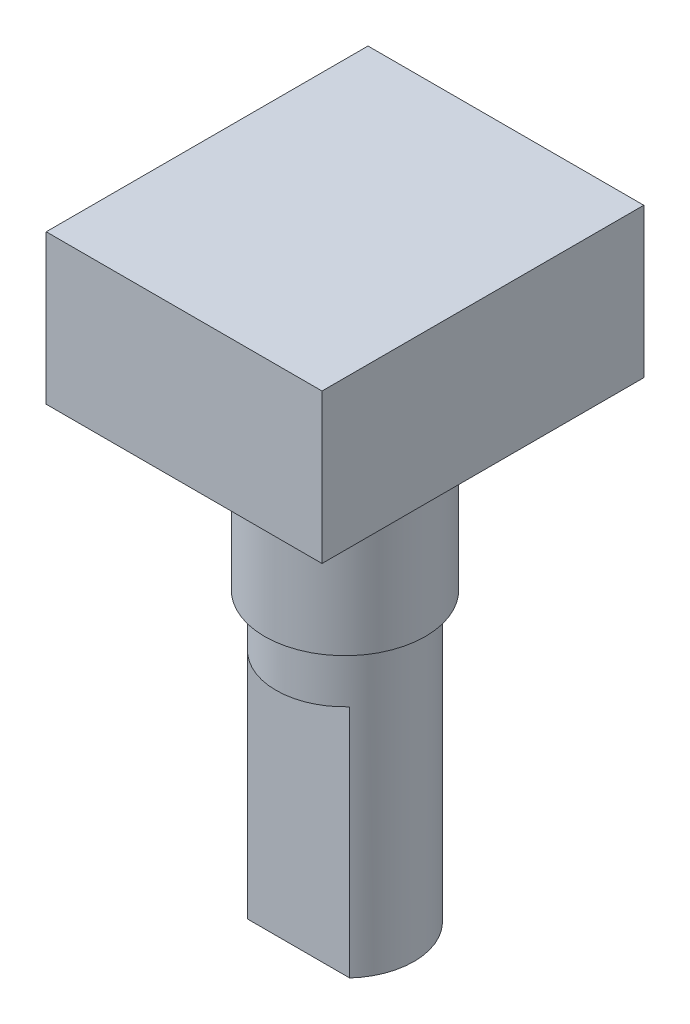
ISO-10303-21;
HEADER;
FILE_DESCRIPTION(('STEP AP214'),'2;1');
FILE_NAME('part.step','',(''),(''),'','','');
FILE_SCHEMA(('AUTOMOTIVE_DESIGN { 1 0 10303 214 1 1 1 1 }'));
ENDSEC;
DATA;
#1=APPLICATION_CONTEXT('core data for automotive mechanical design processes');
#2=APPLICATION_PROTOCOL_DEFINITION('international standard','automotive_design',2000,#1);
#3=PRODUCT_CONTEXT('',#1,'mechanical');
#4=PRODUCT('Part','Part','',(#3));
#5=PRODUCT_RELATED_PRODUCT_CATEGORY('part','',(#4));
#6=PRODUCT_DEFINITION_FORMATION('','',#4);
#7=PRODUCT_DEFINITION_CONTEXT('part definition',#1,'design');
#8=PRODUCT_DEFINITION('design','',#6,#7);
#9=PRODUCT_DEFINITION_SHAPE('','',#8);
#10=(LENGTH_UNIT() NAMED_UNIT(*) SI_UNIT(.MILLI.,.METRE.));
#11=(NAMED_UNIT(*) PLANE_ANGLE_UNIT() SI_UNIT($,.RADIAN.));
#12=(NAMED_UNIT(*) SI_UNIT($,.STERADIAN.) SOLID_ANGLE_UNIT());
#13=UNCERTAINTY_MEASURE_WITH_UNIT(LENGTH_MEASURE(1.E-05),#10,'distance_accuracy_value','');
#14=(GEOMETRIC_REPRESENTATION_CONTEXT(3) GLOBAL_UNCERTAINTY_ASSIGNED_CONTEXT((#13)) GLOBAL_UNIT_ASSIGNED_CONTEXT((#10,
#11,#12)) REPRESENTATION_CONTEXT('',''));
#15=CARTESIAN_POINT('',(0.,0.,0.));
#16=DIRECTION('',(0.,0.,1.));
#17=DIRECTION('',(1.,0.,0.));
#18=AXIS2_PLACEMENT_3D('',#15,#16,#17);
#19=CARTESIAN_POINT('',(-6.,6.50000000000001,7.00000000000001));
#20=DIRECTION('',(1.,0.,0.));
#21=DIRECTION('',(0.,0.,-1.));
#22=AXIS2_PLACEMENT_3D('',#19,#20,#21);
#23=PLANE('',#22);
#24=DIRECTION('',(0.,0.,1.));
#25=VECTOR('',#24,1.);
#26=CARTESIAN_POINT('',(-6.,0.,7.00000000000001));
#27=LINE('',#26,#25);
#28=CARTESIAN_POINT('',(-6.,0.,-7.));
#29=VERTEX_POINT('',#28);
#30=CARTESIAN_POINT('',(-6.,0.,7.00000000000001));
#31=VERTEX_POINT('',#30);
#32=EDGE_CURVE('E113',#29,#31,#27,.T.);
#33=ORIENTED_EDGE('',*,*,#32,.T.);
#34=DIRECTION('',(0.,-1.,0.));
#35=VECTOR('',#34,1.);
#36=CARTESIAN_POINT('',(-6.,6.50000000000001,7.00000000000001));
#37=LINE('',#36,#35);
#38=CARTESIAN_POINT('',(-6.,6.50000000000001,7.00000000000001));
#39=VERTEX_POINT('',#38);
#40=EDGE_CURVE('E139',#39,#31,#37,.T.);
#41=ORIENTED_EDGE('',*,*,#40,.F.);
#42=DIRECTION('',(0.,0.,1.));
#43=VECTOR('',#42,1.);
#44=CARTESIAN_POINT('',(-6.,6.50000000000001,7.00000000000001));
#45=LINE('',#44,#43);
#46=CARTESIAN_POINT('',(-6.,6.50000000000001,-7.));
#47=VERTEX_POINT('',#46);
#48=EDGE_CURVE('E119',#47,#39,#45,.T.);
#49=ORIENTED_EDGE('',*,*,#48,.F.);
#50=DIRECTION('',(0.,-1.,0.));
#51=VECTOR('',#50,1.);
#52=CARTESIAN_POINT('',(-6.,6.50000000000001,-7.));
#53=LINE('',#52,#51);
#54=EDGE_CURVE('E125',#47,#29,#53,.T.);
#55=ORIENTED_EDGE('',*,*,#54,.T.);
#56=EDGE_LOOP('',(#33,#41,#49,#55));
#57=FACE_BOUND('',#56,.T.);
#58=ADVANCED_FACE('F34',(#57),#23,.F.);
#59=CARTESIAN_POINT('',(6.,6.50000000000001,7.00000000000001));
#60=DIRECTION('',(0.,0.,-1.));
#61=DIRECTION('',(-1.,0.,0.));
#62=AXIS2_PLACEMENT_3D('',#59,#60,#61);
#63=PLANE('',#62);
#64=DIRECTION('',(1.,0.,0.));
#65=VECTOR('',#64,1.);
#66=CARTESIAN_POINT('',(6.,0.,7.00000000000001));
#67=LINE('',#66,#65);
#68=CARTESIAN_POINT('',(6.,0.,7.00000000000001));
#69=VERTEX_POINT('',#68);
#70=EDGE_CURVE('E128',#31,#69,#67,.T.);
#71=ORIENTED_EDGE('',*,*,#70,.T.);
#72=DIRECTION('',(0.,-1.,0.));
#73=VECTOR('',#72,1.);
#74=CARTESIAN_POINT('',(6.,6.50000000000001,7.00000000000001));
#75=LINE('',#74,#73);
#76=CARTESIAN_POINT('',(6.,6.50000000000001,7.00000000000001));
#77=VERTEX_POINT('',#76);
#78=EDGE_CURVE('E136',#77,#69,#75,.T.);
#79=ORIENTED_EDGE('',*,*,#78,.F.);
#80=DIRECTION('',(1.,0.,0.));
#81=VECTOR('',#80,1.);
#82=CARTESIAN_POINT('',(6.,6.50000000000001,7.00000000000001));
#83=LINE('',#82,#81);
#84=EDGE_CURVE('E86',#39,#77,#83,.T.);
#85=ORIENTED_EDGE('',*,*,#84,.F.);
#86=ORIENTED_EDGE('',*,*,#40,.T.);
#87=EDGE_LOOP('',(#71,#79,#85,#86));
#88=FACE_BOUND('',#87,.T.);
#89=ADVANCED_FACE('F161',(#88),#63,.F.);
#90=CARTESIAN_POINT('',(6.,6.50000000000001,7.00000000000001));
#91=DIRECTION('',(-1.,0.,0.));
#92=DIRECTION('',(0.,0.,1.));
#93=AXIS2_PLACEMENT_3D('',#90,#91,#92);
#94=PLANE('',#93);
#95=DIRECTION('',(0.,0.,-1.));
#96=VECTOR('',#95,1.);
#97=CARTESIAN_POINT('',(6.,0.,7.00000000000001));
#98=LINE('',#97,#96);
#99=CARTESIAN_POINT('',(6.,0.,-7.00000000000001));
#100=VERTEX_POINT('',#99);
#101=EDGE_CURVE('E130',#69,#100,#98,.T.);
#102=ORIENTED_EDGE('',*,*,#101,.T.);
#103=DIRECTION('',(0.,-1.,0.));
#104=VECTOR('',#103,1.);
#105=CARTESIAN_POINT('',(6.,6.50000000000001,-7.00000000000001));
#106=LINE('',#105,#104);
#107=CARTESIAN_POINT('',(6.,6.50000000000001,-7.00000000000001));
#108=VERTEX_POINT('',#107);
#109=EDGE_CURVE('E134',#108,#100,#106,.T.);
#110=ORIENTED_EDGE('',*,*,#109,.F.);
#111=DIRECTION('',(0.,0.,-1.));
#112=VECTOR('',#111,1.);
#113=CARTESIAN_POINT('',(6.,6.50000000000001,7.00000000000001));
#114=LINE('',#113,#112);
#115=EDGE_CURVE('E122',#77,#108,#114,.T.);
#116=ORIENTED_EDGE('',*,*,#115,.F.);
#117=ORIENTED_EDGE('',*,*,#78,.T.);
#118=EDGE_LOOP('',(#102,#110,#116,#117));
#119=FACE_BOUND('',#118,.T.);
#120=ADVANCED_FACE('F160',(#119),#94,.F.);
#121=CARTESIAN_POINT('',(6.,6.50000000000001,-7.00000000000001));
#122=DIRECTION('',(0.,0.,1.));
#123=DIRECTION('',(1.,0.,0.));
#124=AXIS2_PLACEMENT_3D('',#121,#122,#123);
#125=PLANE('',#124);
#126=DIRECTION('',(-1.,0.,0.));
#127=VECTOR('',#126,1.);
#128=CARTESIAN_POINT('',(6.,0.,-7.00000000000001));
#129=LINE('',#128,#127);
#130=EDGE_CURVE('E78',#100,#29,#129,.T.);
#131=ORIENTED_EDGE('',*,*,#130,.T.);
#132=ORIENTED_EDGE('',*,*,#54,.F.);
#133=DIRECTION('',(-1.,0.,0.));
#134=VECTOR('',#133,1.);
#135=CARTESIAN_POINT('',(6.,6.50000000000001,-7.00000000000001));
#136=LINE('',#135,#134);
#137=EDGE_CURVE('E57',#108,#47,#136,.T.);
#138=ORIENTED_EDGE('',*,*,#137,.F.);
#139=ORIENTED_EDGE('',*,*,#109,.T.);
#140=EDGE_LOOP('',(#131,#132,#138,#139));
#141=FACE_BOUND('',#140,.T.);
#142=ADVANCED_FACE('F156',(#141),#125,.F.);
#143=CARTESIAN_POINT('',(0.,6.50000000000001,0.));
#144=DIRECTION('',(0.,1.,0.));
#145=DIRECTION('',(0.,0.,1.));
#146=AXIS2_PLACEMENT_3D('',#143,#144,#145);
#147=PLANE('',#146);
#148=ORIENTED_EDGE('',*,*,#48,.T.);
#149=ORIENTED_EDGE('',*,*,#84,.T.);
#150=ORIENTED_EDGE('',*,*,#115,.T.);
#151=ORIENTED_EDGE('',*,*,#137,.T.);
#152=EDGE_LOOP('',(#148,#149,#150,#151));
#153=FACE_BOUND('',#152,.T.);
#154=ADVANCED_FACE('F149',(#153),#147,.T.);
#155=CARTESIAN_POINT('',(0.,0.,0.));
#156=DIRECTION('',(0.,1.,0.));
#157=DIRECTION('',(0.,0.,1.));
#158=AXIS2_PLACEMENT_3D('',#155,#156,#157);
#159=PLANE('',#158);
#160=CARTESIAN_POINT('',(0.,0.,0.));
#161=DIRECTION('',(0.,1.,0.));
#162=DIRECTION('',(0.,0.,1.));
#163=AXIS2_PLACEMENT_3D('',#160,#161,#162);
#164=CIRCLE('',#163,3.5);
#165=CARTESIAN_POINT('',(0.,0.,3.5));
#166=VERTEX_POINT('',#165);
#167=EDGE_CURVE('E100',#166,#166,#164,.F.);
#168=ORIENTED_EDGE('',*,*,#167,.F.);
#169=EDGE_LOOP('',(#168));
#170=FACE_BOUND('',#169,.T.);
#171=ORIENTED_EDGE('',*,*,#32,.F.);
#172=ORIENTED_EDGE('',*,*,#130,.F.);
#173=ORIENTED_EDGE('',*,*,#101,.F.);
#174=ORIENTED_EDGE('',*,*,#70,.F.);
#175=EDGE_LOOP('',(#171,#172,#173,#174));
#176=FACE_BOUND('',#175,.T.);
#177=ADVANCED_FACE('F146',(#170,#176),#159,.F.);
#178=CARTESIAN_POINT('',(0.,-7.50000000000001,0.));
#179=DIRECTION('',(0.,1.,0.));
#180=DIRECTION('',(0.,0.,1.));
#181=AXIS2_PLACEMENT_3D('',#178,#179,#180);
#182=CYLINDRICAL_SURFACE('',#181,3.5);
#183=CARTESIAN_POINT('',(0.,-7.50000000000001,0.));
#184=DIRECTION('',(0.,-1.,0.));
#185=DIRECTION('',(0.,0.,-1.));
#186=AXIS2_PLACEMENT_3D('',#183,#184,#185);
#187=CIRCLE('',#186,3.5);
#188=CARTESIAN_POINT('',(0.,-7.50000000000001,-3.5));
#189=VERTEX_POINT('',#188);
#190=EDGE_CURVE('E109',#189,#189,#187,.T.);
#191=ORIENTED_EDGE('',*,*,#190,.F.);
#192=EDGE_LOOP('',(#191));
#193=FACE_BOUND('',#192,.T.);
#194=ORIENTED_EDGE('',*,*,#167,.T.);
#195=EDGE_LOOP('',(#194));
#196=FACE_BOUND('',#195,.T.);
#197=ADVANCED_FACE('F144',(#193,#196),#182,.T.);
#198=CARTESIAN_POINT('',(0.,-7.50000000000001,0.));
#199=DIRECTION('',(0.,-1.,0.));
#200=DIRECTION('',(0.,0.,-1.));
#201=AXIS2_PLACEMENT_3D('',#198,#199,#200);
#202=PLANE('',#201);
#203=CARTESIAN_POINT('',(0.,-7.50000000000001,0.));
#204=DIRECTION('',(0.,-1.,0.));
#205=DIRECTION('',(0.,0.,-1.));
#206=AXIS2_PLACEMENT_3D('',#203,#204,#205);
#207=CIRCLE('',#206,3.);
#208=CARTESIAN_POINT('',(0.,-7.50000000000001,-3.));
#209=VERTEX_POINT('',#208);
#210=EDGE_CURVE('E110',#209,#209,#207,.T.);
#211=ORIENTED_EDGE('',*,*,#210,.F.);
#212=EDGE_LOOP('',(#211));
#213=FACE_BOUND('',#212,.T.);
#214=ORIENTED_EDGE('',*,*,#190,.T.);
#215=EDGE_LOOP('',(#214));
#216=FACE_BOUND('',#215,.T.);
#217=ADVANCED_FACE('F175',(#213,#216),#202,.T.);
#218=CARTESIAN_POINT('',(0.,-20.,0.));
#219=DIRECTION('',(0.,1.,0.));
#220=DIRECTION('',(0.,0.,1.));
#221=AXIS2_PLACEMENT_3D('',#218,#219,#220);
#222=CYLINDRICAL_SURFACE('',#221,3.);
#223=CARTESIAN_POINT('',(0.,-20.,0.));
#224=DIRECTION('',(0.,-1.,0.));
#225=DIRECTION('',(0.,0.,-1.));
#226=AXIS2_PLACEMENT_3D('',#223,#224,#225);
#227=CIRCLE('',#226,3.);
#228=CARTESIAN_POINT('',(-2.22027025382047,-20.,2.01752323406696));
#229=VERTEX_POINT('',#228);
#230=CARTESIAN_POINT('',(2.22027025382047,-20.,2.01752323406696));
#231=VERTEX_POINT('',#230);
#232=EDGE_CURVE('E105',#229,#231,#227,.T.);
#233=ORIENTED_EDGE('',*,*,#232,.F.);
#234=DIRECTION('',(0.,1.,0.));
#235=VECTOR('',#234,1.);
#236=CARTESIAN_POINT('',(-2.22027025382047,-20.,2.01752323406696));
#237=LINE('',#236,#235);
#238=CARTESIAN_POINT('',(-2.22027025382047,-9.78,2.01752323406696));
#239=VERTEX_POINT('',#238);
#240=EDGE_CURVE('E48',#229,#239,#237,.T.);
#241=ORIENTED_EDGE('',*,*,#240,.T.);
#242=CARTESIAN_POINT('',(0.,-9.78,0.));
#243=DIRECTION('',(0.,-1.,0.));
#244=DIRECTION('',(0.,0.,-1.));
#245=AXIS2_PLACEMENT_3D('',#242,#243,#244);
#246=CIRCLE('',#245,3.);
#247=CARTESIAN_POINT('',(2.22027025382047,-9.78,2.01752323406696));
#248=VERTEX_POINT('',#247);
#249=EDGE_CURVE('E11',#248,#239,#246,.T.);
#250=ORIENTED_EDGE('',*,*,#249,.F.);
#251=DIRECTION('',(0.,1.,0.));
#252=VECTOR('',#251,1.);
#253=CARTESIAN_POINT('',(2.22027025382047,-20.,2.01752323406696));
#254=LINE('',#253,#252);
#255=EDGE_CURVE('E95',#248,#231,#254,.F.);
#256=ORIENTED_EDGE('',*,*,#255,.T.);
#257=EDGE_LOOP('',(#233,#241,#250,#256));
#258=FACE_BOUND('',#257,.T.);
#259=ORIENTED_EDGE('',*,*,#210,.T.);
#260=EDGE_LOOP('',(#259));
#261=FACE_BOUND('',#260,.T.);
#262=ADVANCED_FACE('F103',(#258,#261),#222,.T.);
#263=CARTESIAN_POINT('',(0.,-20.,0.));
#264=DIRECTION('',(0.,-1.,0.));
#265=DIRECTION('',(0.,0.,-1.));
#266=AXIS2_PLACEMENT_3D('',#263,#264,#265);
#267=PLANE('',#266);
#268=DIRECTION('',(1.,0.,0.));
#269=VECTOR('',#268,1.);
#270=CARTESIAN_POINT('',(0.,-20.,2.01752323406696));
#271=LINE('',#270,#269);
#272=EDGE_CURVE('E41',#229,#231,#271,.T.);
#273=ORIENTED_EDGE('',*,*,#272,.F.);
#274=ORIENTED_EDGE('',*,*,#232,.T.);
#275=EDGE_LOOP('',(#273,#274));
#276=FACE_BOUND('',#275,.T.);
#277=ADVANCED_FACE('F108',(#276),#267,.T.);
#278=CARTESIAN_POINT('',(0.,-9.78,0.));
#279=DIRECTION('',(0.,-1.,0.));
#280=DIRECTION('',(0.,0.,-1.));
#281=AXIS2_PLACEMENT_3D('',#278,#279,#280);
#282=PLANE('',#281);
#283=ORIENTED_EDGE('',*,*,#249,.T.);
#284=DIRECTION('',(1.,0.,0.));
#285=VECTOR('',#284,1.);
#286=CARTESIAN_POINT('',(-2.86,-9.78,2.01752323406696));
#287=LINE('',#286,#285);
#288=EDGE_CURVE('E106',#239,#248,#287,.T.);
#289=ORIENTED_EDGE('',*,*,#288,.T.);
#290=EDGE_LOOP('',(#283,#289));
#291=FACE_BOUND('',#290,.T.);
#292=ADVANCED_FACE('F184',(#291),#282,.T.);
#293=CARTESIAN_POINT('',(-2.86,-9.78,2.01752323406696));
#294=DIRECTION('',(0.,0.,-1.));
#295=DIRECTION('',(-1.,0.,0.));
#296=AXIS2_PLACEMENT_3D('',#293,#294,#295);
#297=PLANE('',#296);
#298=ORIENTED_EDGE('',*,*,#272,.T.);
#299=ORIENTED_EDGE('',*,*,#255,.F.);
#300=ORIENTED_EDGE('',*,*,#288,.F.);
#301=ORIENTED_EDGE('',*,*,#240,.F.);
#302=EDGE_LOOP('',(#298,#299,#300,#301));
#303=FACE_BOUND('',#302,.T.);
#304=ADVANCED_FACE('F94',(#303),#297,.F.);
#305=CLOSED_SHELL('',(#58,#89,#120,#142,#154,#177,#197,#217,#262,#277,#292,#304));
#306=MANIFOLD_SOLID_BREP('B2',#305);
#307=ADVANCED_BREP_SHAPE_REPRESENTATION('',(#18,#306),#14);
#308=SHAPE_DEFINITION_REPRESENTATION(#9,#307);
ENDSEC;
END-ISO-10303-21;
